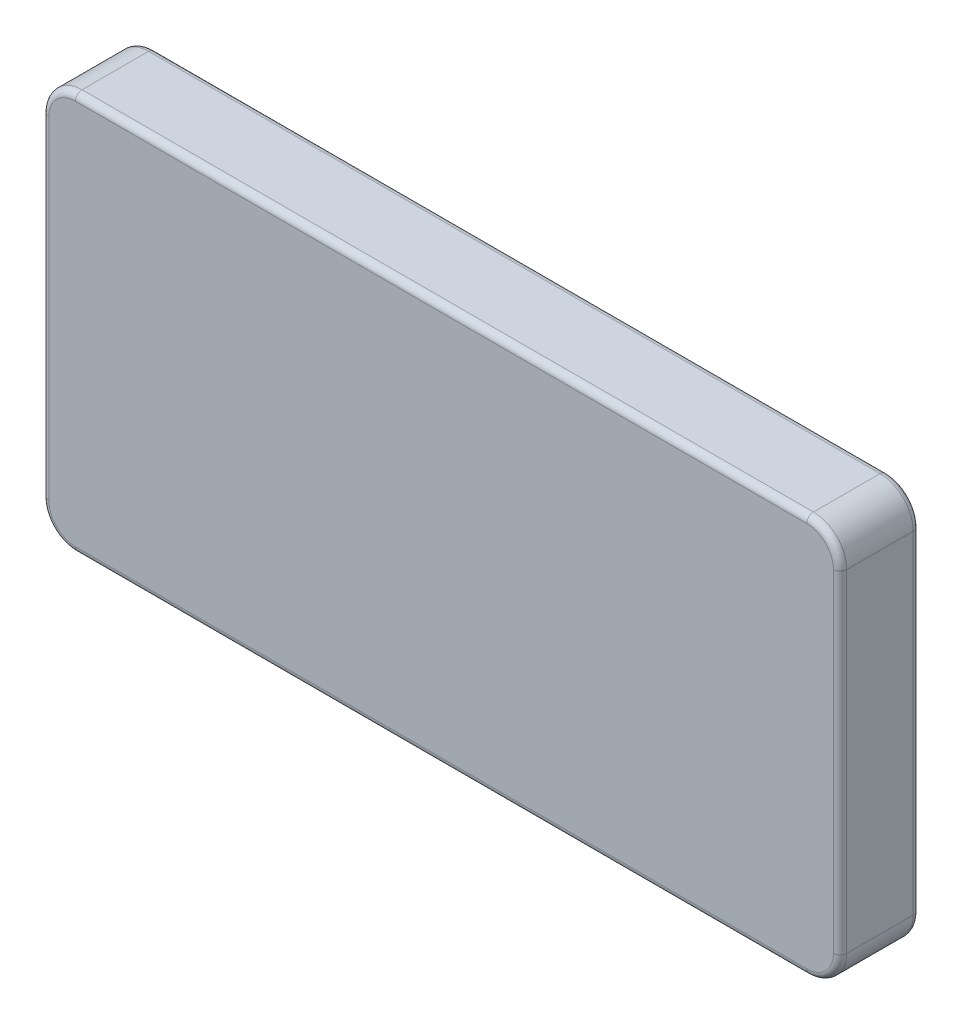
ISO-10303-21;
HEADER;
FILE_DESCRIPTION(('STEP AP214'),'2;1');
FILE_NAME('part.step','',(''),(''),'','','');
FILE_SCHEMA(('AUTOMOTIVE_DESIGN { 1 0 10303 214 1 1 1 1 }'));
ENDSEC;
DATA;
#1=APPLICATION_CONTEXT('core data for automotive mechanical design processes');
#2=APPLICATION_PROTOCOL_DEFINITION('international standard','automotive_design',2000,#1);
#3=PRODUCT_CONTEXT('',#1,'mechanical');
#4=PRODUCT('Part','Part','',(#3));
#5=PRODUCT_RELATED_PRODUCT_CATEGORY('part','',(#4));
#6=PRODUCT_DEFINITION_FORMATION('','',#4);
#7=PRODUCT_DEFINITION_CONTEXT('part definition',#1,'design');
#8=PRODUCT_DEFINITION('design','',#6,#7);
#9=PRODUCT_DEFINITION_SHAPE('','',#8);
#10=(LENGTH_UNIT() NAMED_UNIT(*) SI_UNIT(.MILLI.,.METRE.));
#11=(NAMED_UNIT(*) PLANE_ANGLE_UNIT() SI_UNIT($,.RADIAN.));
#12=(NAMED_UNIT(*) SI_UNIT($,.STERADIAN.) SOLID_ANGLE_UNIT());
#13=UNCERTAINTY_MEASURE_WITH_UNIT(LENGTH_MEASURE(1.E-05),#10,'distance_accuracy_value','');
#14=(GEOMETRIC_REPRESENTATION_CONTEXT(3) GLOBAL_UNCERTAINTY_ASSIGNED_CONTEXT((#13)) GLOBAL_UNIT_ASSIGNED_CONTEXT((#10,
#11,#12)) REPRESENTATION_CONTEXT('',''));
#15=CARTESIAN_POINT('',(0.,0.,0.));
#16=DIRECTION('',(0.,0.,1.));
#17=DIRECTION('',(1.,0.,0.));
#18=AXIS2_PLACEMENT_3D('',#15,#16,#17);
#19=CARTESIAN_POINT('',(0.,0.,120.));
#20=DIRECTION('',(0.,0.,-1.));
#21=DIRECTION('',(-1.,0.,0.));
#22=AXIS2_PLACEMENT_3D('',#19,#20,#21);
#23=PLANE('',#22);
#24=CARTESIAN_POINT('',(1150.,50.,120.));
#25=DIRECTION('',(0.,0.,-1.));
#26=DIRECTION('',(-1.,0.,0.));
#27=AXIS2_PLACEMENT_3D('',#24,#25,#26);
#28=CIRCLE('',#27,40.);
#29=CARTESIAN_POINT('',(1190.,50.,120.));
#30=VERTEX_POINT('',#29);
#31=CARTESIAN_POINT('',(1150.,10.,120.));
#32=VERTEX_POINT('',#31);
#33=EDGE_CURVE('E214',#30,#32,#28,.T.);
#34=ORIENTED_EDGE('',*,*,#33,.F.);
#35=DIRECTION('',(0.,1.,0.));
#36=VECTOR('',#35,1.);
#37=CARTESIAN_POINT('',(1190.,0.,120.));
#38=LINE('',#37,#36);
#39=CARTESIAN_POINT('',(1190.,550.,120.));
#40=VERTEX_POINT('',#39);
#41=EDGE_CURVE('E281',#30,#40,#38,.T.);
#42=ORIENTED_EDGE('',*,*,#41,.T.);
#43=CARTESIAN_POINT('',(1150.,550.,120.));
#44=DIRECTION('',(0.,0.,-1.));
#45=DIRECTION('',(-1.,0.,0.));
#46=AXIS2_PLACEMENT_3D('',#43,#44,#45);
#47=CIRCLE('',#46,40.);
#48=CARTESIAN_POINT('',(1150.,590.,120.));
#49=VERTEX_POINT('',#48);
#50=EDGE_CURVE('E211',#49,#40,#47,.T.);
#51=ORIENTED_EDGE('',*,*,#50,.F.);
#52=DIRECTION('',(-1.,0.,0.));
#53=VECTOR('',#52,1.);
#54=CARTESIAN_POINT('',(0.,590.,120.));
#55=LINE('',#54,#53);
#56=CARTESIAN_POINT('',(50.,590.,120.));
#57=VERTEX_POINT('',#56);
#58=EDGE_CURVE('E192',#49,#57,#55,.T.);
#59=ORIENTED_EDGE('',*,*,#58,.T.);
#60=CARTESIAN_POINT('',(50.,550.,120.));
#61=DIRECTION('',(0.,0.,-1.));
#62=DIRECTION('',(-1.,0.,0.));
#63=AXIS2_PLACEMENT_3D('',#60,#61,#62);
#64=CIRCLE('',#63,40.);
#65=CARTESIAN_POINT('',(10.,550.,120.));
#66=VERTEX_POINT('',#65);
#67=EDGE_CURVE('E205',#66,#57,#64,.T.);
#68=ORIENTED_EDGE('',*,*,#67,.F.);
#69=DIRECTION('',(0.,-1.,0.));
#70=VECTOR('',#69,1.);
#71=CARTESIAN_POINT('',(10.,0.,120.));
#72=LINE('',#71,#70);
#73=CARTESIAN_POINT('',(10.,50.,120.));
#74=VERTEX_POINT('',#73);
#75=EDGE_CURVE('E287',#66,#74,#72,.T.);
#76=ORIENTED_EDGE('',*,*,#75,.T.);
#77=CARTESIAN_POINT('',(50.,50.,120.));
#78=DIRECTION('',(0.,0.,-1.));
#79=DIRECTION('',(-1.,0.,0.));
#80=AXIS2_PLACEMENT_3D('',#77,#78,#79);
#81=CIRCLE('',#80,40.);
#82=CARTESIAN_POINT('',(50.,10.,120.));
#83=VERTEX_POINT('',#82);
#84=EDGE_CURVE('E208',#83,#74,#81,.T.);
#85=ORIENTED_EDGE('',*,*,#84,.F.);
#86=DIRECTION('',(1.,0.,0.));
#87=VECTOR('',#86,1.);
#88=CARTESIAN_POINT('',(0.,10.,120.));
#89=LINE('',#88,#87);
#90=EDGE_CURVE('E282',#83,#32,#89,.T.);
#91=ORIENTED_EDGE('',*,*,#90,.T.);
#92=EDGE_LOOP('',(#34,#42,#51,#59,#68,#76,#85,#91));
#93=FACE_BOUND('',#92,.T.);
#94=ADVANCED_FACE('F35',(#93),#23,.F.);
#95=CARTESIAN_POINT('',(0.,0.,0.));
#96=DIRECTION('',(0.,0.,-1.));
#97=DIRECTION('',(-1.,0.,0.));
#98=AXIS2_PLACEMENT_3D('',#95,#96,#97);
#99=PLANE('',#98);
#100=CARTESIAN_POINT('',(1150.,50.,0.));
#101=DIRECTION('',(0.,0.,-1.));
#102=DIRECTION('',(-1.,0.,0.));
#103=AXIS2_PLACEMENT_3D('',#100,#101,#102);
#104=CIRCLE('',#103,40.);
#105=CARTESIAN_POINT('',(1150.,10.,0.));
#106=VERTEX_POINT('',#105);
#107=CARTESIAN_POINT('',(1190.,50.,0.));
#108=VERTEX_POINT('',#107);
#109=EDGE_CURVE('E186',#106,#108,#104,.F.);
#110=ORIENTED_EDGE('',*,*,#109,.F.);
#111=DIRECTION('',(1.,0.,0.));
#112=VECTOR('',#111,1.);
#113=CARTESIAN_POINT('',(0.,10.,0.));
#114=LINE('',#113,#112);
#115=CARTESIAN_POINT('',(50.,10.,0.));
#116=VERTEX_POINT('',#115);
#117=EDGE_CURVE('E299',#106,#116,#114,.F.);
#118=ORIENTED_EDGE('',*,*,#117,.T.);
#119=CARTESIAN_POINT('',(50.,50.,0.));
#120=DIRECTION('',(0.,0.,-1.));
#121=DIRECTION('',(-1.,0.,0.));
#122=AXIS2_PLACEMENT_3D('',#119,#120,#121);
#123=CIRCLE('',#122,40.);
#124=CARTESIAN_POINT('',(10.,50.,0.));
#125=VERTEX_POINT('',#124);
#126=EDGE_CURVE('E190',#125,#116,#123,.F.);
#127=ORIENTED_EDGE('',*,*,#126,.F.);
#128=DIRECTION('',(0.,-1.,0.));
#129=VECTOR('',#128,1.);
#130=CARTESIAN_POINT('',(10.,600.,0.));
#131=LINE('',#130,#129);
#132=CARTESIAN_POINT('',(10.,550.,0.));
#133=VERTEX_POINT('',#132);
#134=EDGE_CURVE('E307',#125,#133,#131,.F.);
#135=ORIENTED_EDGE('',*,*,#134,.T.);
#136=CARTESIAN_POINT('',(50.,550.,0.));
#137=DIRECTION('',(0.,0.,-1.));
#138=DIRECTION('',(-1.,0.,0.));
#139=AXIS2_PLACEMENT_3D('',#136,#137,#138);
#140=CIRCLE('',#139,40.);
#141=CARTESIAN_POINT('',(50.,590.,0.));
#142=VERTEX_POINT('',#141);
#143=EDGE_CURVE('E187',#142,#133,#140,.F.);
#144=ORIENTED_EDGE('',*,*,#143,.F.);
#145=DIRECTION('',(-1.,0.,0.));
#146=VECTOR('',#145,1.);
#147=CARTESIAN_POINT('',(1200.,590.,0.));
#148=LINE('',#147,#146);
#149=CARTESIAN_POINT('',(1150.,590.,0.));
#150=VERTEX_POINT('',#149);
#151=EDGE_CURVE('E304',#142,#150,#148,.F.);
#152=ORIENTED_EDGE('',*,*,#151,.T.);
#153=CARTESIAN_POINT('',(1150.,550.,0.));
#154=DIRECTION('',(0.,0.,-1.));
#155=DIRECTION('',(-1.,0.,0.));
#156=AXIS2_PLACEMENT_3D('',#153,#154,#155);
#157=CIRCLE('',#156,40.);
#158=CARTESIAN_POINT('',(1190.,550.,0.));
#159=VERTEX_POINT('',#158);
#160=EDGE_CURVE('E198',#159,#150,#157,.F.);
#161=ORIENTED_EDGE('',*,*,#160,.F.);
#162=DIRECTION('',(0.,1.,0.));
#163=VECTOR('',#162,1.);
#164=CARTESIAN_POINT('',(1190.,0.,0.));
#165=LINE('',#164,#163);
#166=EDGE_CURVE('E302',#159,#108,#165,.F.);
#167=ORIENTED_EDGE('',*,*,#166,.T.);
#168=EDGE_LOOP('',(#110,#118,#127,#135,#144,#152,#161,#167));
#169=FACE_BOUND('',#168,.T.);
#170=ADVANCED_FACE('F338',(#169),#99,.T.);
#171=CARTESIAN_POINT('',(0.,0.,120.));
#172=DIRECTION('',(1.,0.,0.));
#173=DIRECTION('',(0.,0.,-1.));
#174=AXIS2_PLACEMENT_3D('',#171,#172,#173);
#175=PLANE('',#174);
#176=DIRECTION('',(0.,-1.,0.));
#177=VECTOR('',#176,1.);
#178=CARTESIAN_POINT('',(0.,0.,110.));
#179=LINE('',#178,#177);
#180=CARTESIAN_POINT('',(0.,50.,110.));
#181=VERTEX_POINT('',#180);
#182=CARTESIAN_POINT('',(0.,550.,110.));
#183=VERTEX_POINT('',#182);
#184=EDGE_CURVE('E292',#181,#183,#179,.F.);
#185=ORIENTED_EDGE('',*,*,#184,.T.);
#186=DIRECTION('',(0.,0.,-1.));
#187=VECTOR('',#186,1.);
#188=CARTESIAN_POINT('',(0.,550.,120.));
#189=LINE('',#188,#187);
#190=CARTESIAN_POINT('',(0.,550.,9.99999999999999));
#191=VERTEX_POINT('',#190);
#192=EDGE_CURVE('E243',#183,#191,#189,.T.);
#193=ORIENTED_EDGE('',*,*,#192,.T.);
#194=DIRECTION('',(0.,-1.,0.));
#195=VECTOR('',#194,1.);
#196=CARTESIAN_POINT('',(0.,0.,9.99999999999999));
#197=LINE('',#196,#195);
#198=CARTESIAN_POINT('',(0.,50.,9.99999999999999));
#199=VERTEX_POINT('',#198);
#200=EDGE_CURVE('E289',#191,#199,#197,.T.);
#201=ORIENTED_EDGE('',*,*,#200,.T.);
#202=DIRECTION('',(0.,0.,-1.));
#203=VECTOR('',#202,1.);
#204=CARTESIAN_POINT('',(0.,50.,120.));
#205=LINE('',#204,#203);
#206=EDGE_CURVE('E241',#199,#181,#205,.F.);
#207=ORIENTED_EDGE('',*,*,#206,.T.);
#208=EDGE_LOOP('',(#185,#193,#201,#207));
#209=FACE_BOUND('',#208,.T.);
#210=ADVANCED_FACE('F369',(#209),#175,.F.);
#211=CARTESIAN_POINT('',(0.,0.,120.));
#212=DIRECTION('',(0.,1.,0.));
#213=DIRECTION('',(0.,0.,1.));
#214=AXIS2_PLACEMENT_3D('',#211,#212,#213);
#215=PLANE('',#214);
#216=DIRECTION('',(1.,0.,0.));
#217=VECTOR('',#216,1.);
#218=CARTESIAN_POINT('',(0.,0.,110.));
#219=LINE('',#218,#217);
#220=CARTESIAN_POINT('',(1150.,0.,110.));
#221=VERTEX_POINT('',#220);
#222=CARTESIAN_POINT('',(50.,0.,110.));
#223=VERTEX_POINT('',#222);
#224=EDGE_CURVE('E251',#221,#223,#219,.F.);
#225=ORIENTED_EDGE('',*,*,#224,.T.);
#226=DIRECTION('',(0.,0.,-1.));
#227=VECTOR('',#226,1.);
#228=CARTESIAN_POINT('',(50.,0.,120.));
#229=LINE('',#228,#227);
#230=CARTESIAN_POINT('',(50.,0.,9.99999999999999));
#231=VERTEX_POINT('',#230);
#232=EDGE_CURVE('E162',#223,#231,#229,.T.);
#233=ORIENTED_EDGE('',*,*,#232,.T.);
#234=DIRECTION('',(1.,0.,0.));
#235=VECTOR('',#234,1.);
#236=CARTESIAN_POINT('',(1200.,0.,9.99999999999999));
#237=LINE('',#236,#235);
#238=CARTESIAN_POINT('',(1150.,0.,9.99999999999999));
#239=VERTEX_POINT('',#238);
#240=EDGE_CURVE('E310',#231,#239,#237,.T.);
#241=ORIENTED_EDGE('',*,*,#240,.T.);
#242=DIRECTION('',(0.,0.,-1.));
#243=VECTOR('',#242,1.);
#244=CARTESIAN_POINT('',(1150.,0.,120.));
#245=LINE('',#244,#243);
#246=EDGE_CURVE('E179',#239,#221,#245,.F.);
#247=ORIENTED_EDGE('',*,*,#246,.T.);
#248=EDGE_LOOP('',(#225,#233,#241,#247));
#249=FACE_BOUND('',#248,.T.);
#250=ADVANCED_FACE('F317',(#249),#215,.F.);
#251=CARTESIAN_POINT('',(1200.,0.,120.));
#252=DIRECTION('',(-1.,0.,0.));
#253=DIRECTION('',(0.,0.,1.));
#254=AXIS2_PLACEMENT_3D('',#251,#252,#253);
#255=PLANE('',#254);
#256=DIRECTION('',(0.,1.,0.));
#257=VECTOR('',#256,1.);
#258=CARTESIAN_POINT('',(1200.,600.,9.99999999999999));
#259=LINE('',#258,#257);
#260=CARTESIAN_POINT('',(1200.,50.,9.99999999999999));
#261=VERTEX_POINT('',#260);
#262=CARTESIAN_POINT('',(1200.,550.,9.99999999999999));
#263=VERTEX_POINT('',#262);
#264=EDGE_CURVE('E154',#261,#263,#259,.T.);
#265=ORIENTED_EDGE('',*,*,#264,.T.);
#266=DIRECTION('',(0.,0.,-1.));
#267=VECTOR('',#266,1.);
#268=CARTESIAN_POINT('',(1200.,550.,120.));
#269=LINE('',#268,#267);
#270=CARTESIAN_POINT('',(1200.,550.,110.));
#271=VERTEX_POINT('',#270);
#272=EDGE_CURVE('E11',#263,#271,#269,.F.);
#273=ORIENTED_EDGE('',*,*,#272,.T.);
#274=DIRECTION('',(0.,1.,0.));
#275=VECTOR('',#274,1.);
#276=CARTESIAN_POINT('',(1200.,0.,110.));
#277=LINE('',#276,#275);
#278=CARTESIAN_POINT('',(1200.,50.,110.));
#279=VERTEX_POINT('',#278);
#280=EDGE_CURVE('E157',#271,#279,#277,.F.);
#281=ORIENTED_EDGE('',*,*,#280,.T.);
#282=DIRECTION('',(0.,0.,-1.));
#283=VECTOR('',#282,1.);
#284=CARTESIAN_POINT('',(1200.,50.,120.));
#285=LINE('',#284,#283);
#286=EDGE_CURVE('E44',#279,#261,#285,.T.);
#287=ORIENTED_EDGE('',*,*,#286,.T.);
#288=EDGE_LOOP('',(#265,#273,#281,#287));
#289=FACE_BOUND('',#288,.T.);
#290=ADVANCED_FACE('F153',(#289),#255,.F.);
#291=CARTESIAN_POINT('',(0.,600.,120.));
#292=DIRECTION('',(0.,-1.,0.));
#293=DIRECTION('',(0.,0.,-1.));
#294=AXIS2_PLACEMENT_3D('',#291,#292,#293);
#295=PLANE('',#294);
#296=DIRECTION('',(-1.,0.,0.));
#297=VECTOR('',#296,1.);
#298=CARTESIAN_POINT('',(0.,600.,9.99999999999999));
#299=LINE('',#298,#297);
#300=CARTESIAN_POINT('',(1150.,600.,9.99999999999999));
#301=VERTEX_POINT('',#300);
#302=CARTESIAN_POINT('',(50.,600.,9.99999999999999));
#303=VERTEX_POINT('',#302);
#304=EDGE_CURVE('E295',#301,#303,#299,.T.);
#305=ORIENTED_EDGE('',*,*,#304,.T.);
#306=DIRECTION('',(0.,0.,-1.));
#307=VECTOR('',#306,1.);
#308=CARTESIAN_POINT('',(50.,600.,120.));
#309=LINE('',#308,#307);
#310=CARTESIAN_POINT('',(50.,600.,110.));
#311=VERTEX_POINT('',#310);
#312=EDGE_CURVE('E59',#303,#311,#309,.F.);
#313=ORIENTED_EDGE('',*,*,#312,.T.);
#314=DIRECTION('',(-1.,0.,0.));
#315=VECTOR('',#314,1.);
#316=CARTESIAN_POINT('',(0.,600.,110.));
#317=LINE('',#316,#315);
#318=CARTESIAN_POINT('',(1150.,600.,110.));
#319=VERTEX_POINT('',#318);
#320=EDGE_CURVE('E173',#311,#319,#317,.F.);
#321=ORIENTED_EDGE('',*,*,#320,.T.);
#322=DIRECTION('',(0.,0.,-1.));
#323=VECTOR('',#322,1.);
#324=CARTESIAN_POINT('',(1150.,600.,120.));
#325=LINE('',#324,#323);
#326=EDGE_CURVE('E245',#319,#301,#325,.T.);
#327=ORIENTED_EDGE('',*,*,#326,.T.);
#328=EDGE_LOOP('',(#305,#313,#321,#327));
#329=FACE_BOUND('',#328,.T.);
#330=ADVANCED_FACE('F372',(#329),#295,.F.);
#331=CARTESIAN_POINT('',(0.,590.,9.99999999999999));
#332=DIRECTION('',(1.,0.,0.));
#333=DIRECTION('',(0.,0.,-1.));
#334=AXIS2_PLACEMENT_3D('',#331,#332,#333);
#335=CYLINDRICAL_SURFACE('',#334,10.);
#336=ORIENTED_EDGE('',*,*,#304,.F.);
#337=CARTESIAN_POINT('',(1150.,590.,9.99999999999999));
#338=DIRECTION('',(-1.,0.,0.));
#339=DIRECTION('',(0.,0.,1.));
#340=AXIS2_PLACEMENT_3D('',#337,#338,#339);
#341=CIRCLE('',#340,10.);
#342=EDGE_CURVE('E219',#301,#150,#341,.T.);
#343=ORIENTED_EDGE('',*,*,#342,.T.);
#344=ORIENTED_EDGE('',*,*,#151,.F.);
#345=CARTESIAN_POINT('',(50.,590.,10.));
#346=DIRECTION('',(1.,0.,0.));
#347=DIRECTION('',(0.,0.,-1.));
#348=AXIS2_PLACEMENT_3D('',#345,#346,#347);
#349=CIRCLE('',#348,10.);
#350=EDGE_CURVE('E217',#142,#303,#349,.T.);
#351=ORIENTED_EDGE('',*,*,#350,.T.);
#352=EDGE_LOOP('',(#336,#343,#344,#351));
#353=FACE_BOUND('',#352,.T.);
#354=ADVANCED_FACE('F375',(#353),#335,.T.);
#355=CARTESIAN_POINT('',(10.,0.,9.99999999999999));
#356=DIRECTION('',(0.,1.,0.));
#357=DIRECTION('',(0.,0.,1.));
#358=AXIS2_PLACEMENT_3D('',#355,#356,#357);
#359=CYLINDRICAL_SURFACE('',#358,10.);
#360=ORIENTED_EDGE('',*,*,#200,.F.);
#361=CARTESIAN_POINT('',(10.,550.,9.99999999999999));
#362=DIRECTION('',(0.,-1.,0.));
#363=DIRECTION('',(0.,0.,-1.));
#364=AXIS2_PLACEMENT_3D('',#361,#362,#363);
#365=CIRCLE('',#364,10.);
#366=EDGE_CURVE('E236',#191,#133,#365,.T.);
#367=ORIENTED_EDGE('',*,*,#366,.T.);
#368=ORIENTED_EDGE('',*,*,#134,.F.);
#369=CARTESIAN_POINT('',(10.,50.,10.));
#370=DIRECTION('',(0.,1.,0.));
#371=DIRECTION('',(0.,0.,1.));
#372=AXIS2_PLACEMENT_3D('',#369,#370,#371);
#373=CIRCLE('',#372,10.);
#374=EDGE_CURVE('E234',#125,#199,#373,.T.);
#375=ORIENTED_EDGE('',*,*,#374,.T.);
#376=EDGE_LOOP('',(#360,#367,#368,#375));
#377=FACE_BOUND('',#376,.T.);
#378=ADVANCED_FACE('F388',(#377),#359,.T.);
#379=CARTESIAN_POINT('',(1190.,0.,9.99999999999999));
#380=DIRECTION('',(0.,-1.,0.));
#381=DIRECTION('',(0.,0.,-1.));
#382=AXIS2_PLACEMENT_3D('',#379,#380,#381);
#383=CYLINDRICAL_SURFACE('',#382,10.);
#384=ORIENTED_EDGE('',*,*,#264,.F.);
#385=CARTESIAN_POINT('',(1190.,50.,9.99999999999999));
#386=DIRECTION('',(0.,1.,0.));
#387=DIRECTION('',(0.,0.,1.));
#388=AXIS2_PLACEMENT_3D('',#385,#386,#387);
#389=CIRCLE('',#388,10.);
#390=EDGE_CURVE('E169',#261,#108,#389,.T.);
#391=ORIENTED_EDGE('',*,*,#390,.T.);
#392=ORIENTED_EDGE('',*,*,#166,.F.);
#393=CARTESIAN_POINT('',(1190.,550.,10.));
#394=DIRECTION('',(0.,-1.,0.));
#395=DIRECTION('',(0.,0.,-1.));
#396=AXIS2_PLACEMENT_3D('',#393,#394,#395);
#397=CIRCLE('',#396,10.);
#398=EDGE_CURVE('E172',#159,#263,#397,.T.);
#399=ORIENTED_EDGE('',*,*,#398,.T.);
#400=EDGE_LOOP('',(#384,#391,#392,#399));
#401=FACE_BOUND('',#400,.T.);
#402=ADVANCED_FACE('F166',(#401),#383,.T.);
#403=CARTESIAN_POINT('',(0.,10.,9.99999999999999));
#404=DIRECTION('',(-1.,0.,0.));
#405=DIRECTION('',(0.,0.,1.));
#406=AXIS2_PLACEMENT_3D('',#403,#404,#405);
#407=CYLINDRICAL_SURFACE('',#406,10.);
#408=ORIENTED_EDGE('',*,*,#240,.F.);
#409=CARTESIAN_POINT('',(50.,10.,9.99999999999999));
#410=DIRECTION('',(1.,0.,0.));
#411=DIRECTION('',(0.,0.,-1.));
#412=AXIS2_PLACEMENT_3D('',#409,#410,#411);
#413=CIRCLE('',#412,10.);
#414=EDGE_CURVE('E228',#231,#116,#413,.T.);
#415=ORIENTED_EDGE('',*,*,#414,.T.);
#416=ORIENTED_EDGE('',*,*,#117,.F.);
#417=CARTESIAN_POINT('',(1150.,10.,10.));
#418=DIRECTION('',(-1.,0.,0.));
#419=DIRECTION('',(0.,0.,1.));
#420=AXIS2_PLACEMENT_3D('',#417,#418,#419);
#421=CIRCLE('',#420,10.);
#422=EDGE_CURVE('E226',#106,#239,#421,.T.);
#423=ORIENTED_EDGE('',*,*,#422,.T.);
#424=EDGE_LOOP('',(#408,#415,#416,#423));
#425=FACE_BOUND('',#424,.T.);
#426=ADVANCED_FACE('F336',(#425),#407,.T.);
#427=CARTESIAN_POINT('',(0.,10.,110.));
#428=DIRECTION('',(1.,0.,0.));
#429=DIRECTION('',(0.,0.,-1.));
#430=AXIS2_PLACEMENT_3D('',#427,#428,#429);
#431=CYLINDRICAL_SURFACE('',#430,10.);
#432=ORIENTED_EDGE('',*,*,#224,.F.);
#433=CARTESIAN_POINT('',(1150.,10.,110.));
#434=DIRECTION('',(-1.,0.,0.));
#435=DIRECTION('',(0.,0.,1.));
#436=AXIS2_PLACEMENT_3D('',#433,#434,#435);
#437=CIRCLE('',#436,10.);
#438=EDGE_CURVE('E203',#221,#32,#437,.T.);
#439=ORIENTED_EDGE('',*,*,#438,.T.);
#440=ORIENTED_EDGE('',*,*,#90,.F.);
#441=CARTESIAN_POINT('',(50.,10.,110.));
#442=DIRECTION('',(1.,0.,0.));
#443=DIRECTION('',(0.,0.,-1.));
#444=AXIS2_PLACEMENT_3D('',#441,#442,#443);
#445=CIRCLE('',#444,10.);
#446=EDGE_CURVE('E201',#83,#223,#445,.T.);
#447=ORIENTED_EDGE('',*,*,#446,.T.);
#448=EDGE_LOOP('',(#432,#439,#440,#447));
#449=FACE_BOUND('',#448,.T.);
#450=ADVANCED_FACE('F385',(#449),#431,.T.);
#451=CARTESIAN_POINT('',(1190.,0.,110.));
#452=DIRECTION('',(0.,1.,0.));
#453=DIRECTION('',(0.,0.,1.));
#454=AXIS2_PLACEMENT_3D('',#451,#452,#453);
#455=CYLINDRICAL_SURFACE('',#454,10.);
#456=ORIENTED_EDGE('',*,*,#280,.F.);
#457=CARTESIAN_POINT('',(1190.,550.,110.));
#458=DIRECTION('',(0.,-1.,0.));
#459=DIRECTION('',(0.,0.,-1.));
#460=AXIS2_PLACEMENT_3D('',#457,#458,#459);
#461=CIRCLE('',#460,10.);
#462=EDGE_CURVE('E224',#271,#40,#461,.T.);
#463=ORIENTED_EDGE('',*,*,#462,.T.);
#464=ORIENTED_EDGE('',*,*,#41,.F.);
#465=CARTESIAN_POINT('',(1190.,50.,110.));
#466=DIRECTION('',(0.,1.,0.));
#467=DIRECTION('',(0.,0.,1.));
#468=AXIS2_PLACEMENT_3D('',#465,#466,#467);
#469=CIRCLE('',#468,10.);
#470=EDGE_CURVE('E222',#30,#279,#469,.T.);
#471=ORIENTED_EDGE('',*,*,#470,.T.);
#472=EDGE_LOOP('',(#456,#463,#464,#471));
#473=FACE_BOUND('',#472,.T.);
#474=ADVANCED_FACE('F350',(#473),#455,.T.);
#475=CARTESIAN_POINT('',(10.,0.,110.));
#476=DIRECTION('',(0.,-1.,0.));
#477=DIRECTION('',(0.,0.,-1.));
#478=AXIS2_PLACEMENT_3D('',#475,#476,#477);
#479=CYLINDRICAL_SURFACE('',#478,10.);
#480=ORIENTED_EDGE('',*,*,#184,.F.);
#481=CARTESIAN_POINT('',(10.,50.,110.));
#482=DIRECTION('',(0.,1.,0.));
#483=DIRECTION('',(0.,0.,1.));
#484=AXIS2_PLACEMENT_3D('',#481,#482,#483);
#485=CIRCLE('',#484,10.);
#486=EDGE_CURVE('E232',#181,#74,#485,.T.);
#487=ORIENTED_EDGE('',*,*,#486,.T.);
#488=ORIENTED_EDGE('',*,*,#75,.F.);
#489=CARTESIAN_POINT('',(10.,550.,110.));
#490=DIRECTION('',(0.,-1.,0.));
#491=DIRECTION('',(0.,0.,-1.));
#492=AXIS2_PLACEMENT_3D('',#489,#490,#491);
#493=CIRCLE('',#492,10.);
#494=EDGE_CURVE('E230',#66,#183,#493,.T.);
#495=ORIENTED_EDGE('',*,*,#494,.T.);
#496=EDGE_LOOP('',(#480,#487,#488,#495));
#497=FACE_BOUND('',#496,.T.);
#498=ADVANCED_FACE('F398',(#497),#479,.T.);
#499=CARTESIAN_POINT('',(0.,590.,110.));
#500=DIRECTION('',(-1.,0.,0.));
#501=DIRECTION('',(0.,0.,1.));
#502=AXIS2_PLACEMENT_3D('',#499,#500,#501);
#503=CYLINDRICAL_SURFACE('',#502,10.);
#504=ORIENTED_EDGE('',*,*,#320,.F.);
#505=CARTESIAN_POINT('',(50.,590.,110.));
#506=DIRECTION('',(1.,0.,0.));
#507=DIRECTION('',(0.,0.,-1.));
#508=AXIS2_PLACEMENT_3D('',#505,#506,#507);
#509=CIRCLE('',#508,10.);
#510=EDGE_CURVE('E239',#311,#57,#509,.T.);
#511=ORIENTED_EDGE('',*,*,#510,.T.);
#512=ORIENTED_EDGE('',*,*,#58,.F.);
#513=CARTESIAN_POINT('',(1150.,590.,110.));
#514=DIRECTION('',(-1.,0.,0.));
#515=DIRECTION('',(0.,0.,1.));
#516=AXIS2_PLACEMENT_3D('',#513,#514,#515);
#517=CIRCLE('',#516,10.);
#518=EDGE_CURVE('E52',#49,#319,#517,.T.);
#519=ORIENTED_EDGE('',*,*,#518,.T.);
#520=EDGE_LOOP('',(#504,#511,#512,#519));
#521=FACE_BOUND('',#520,.T.);
#522=ADVANCED_FACE('F276',(#521),#503,.T.);
#523=CARTESIAN_POINT('',(1150.,50.,110.));
#524=DIRECTION('',(0.,0.,-1.));
#525=DIRECTION('',(-1.,0.,0.));
#526=AXIS2_PLACEMENT_3D('',#523,#524,#525);
#527=TOROIDAL_SURFACE('',#526,40.,10.);
#528=ORIENTED_EDGE('',*,*,#33,.T.);
#529=ORIENTED_EDGE('',*,*,#438,.F.);
#530=CARTESIAN_POINT('',(1150.,50.,110.));
#531=DIRECTION('',(0.,0.,-1.));
#532=DIRECTION('',(-1.,0.,0.));
#533=AXIS2_PLACEMENT_3D('',#530,#531,#532);
#534=CIRCLE('',#533,50.);
#535=EDGE_CURVE('E182',#279,#221,#534,.T.);
#536=ORIENTED_EDGE('',*,*,#535,.F.);
#537=ORIENTED_EDGE('',*,*,#470,.F.);
#538=EDGE_LOOP('',(#528,#529,#536,#537));
#539=FACE_BOUND('',#538,.T.);
#540=ADVANCED_FACE('F397',(#539),#527,.T.);
#541=CARTESIAN_POINT('',(1150.,50.,120.));
#542=DIRECTION('',(0.,0.,-1.));
#543=DIRECTION('',(-1.,0.,0.));
#544=AXIS2_PLACEMENT_3D('',#541,#542,#543);
#545=CYLINDRICAL_SURFACE('',#544,50.);
#546=ORIENTED_EDGE('',*,*,#535,.T.);
#547=ORIENTED_EDGE('',*,*,#246,.F.);
#548=CARTESIAN_POINT('',(1150.,50.,9.99999999999999));
#549=DIRECTION('',(0.,0.,-1.));
#550=DIRECTION('',(-1.,0.,0.));
#551=AXIS2_PLACEMENT_3D('',#548,#549,#550);
#552=CIRCLE('',#551,50.);
#553=EDGE_CURVE('E177',#261,#239,#552,.T.);
#554=ORIENTED_EDGE('',*,*,#553,.F.);
#555=ORIENTED_EDGE('',*,*,#286,.F.);
#556=EDGE_LOOP('',(#546,#547,#554,#555));
#557=FACE_BOUND('',#556,.T.);
#558=ADVANCED_FACE('F178',(#557),#545,.T.);
#559=CARTESIAN_POINT('',(1150.,50.,9.99999999999999));
#560=DIRECTION('',(0.,0.,-1.));
#561=DIRECTION('',(-1.,0.,0.));
#562=AXIS2_PLACEMENT_3D('',#559,#560,#561);
#563=TOROIDAL_SURFACE('',#562,40.,10.);
#564=ORIENTED_EDGE('',*,*,#390,.F.);
#565=ORIENTED_EDGE('',*,*,#553,.T.);
#566=ORIENTED_EDGE('',*,*,#422,.F.);
#567=ORIENTED_EDGE('',*,*,#109,.T.);
#568=EDGE_LOOP('',(#564,#565,#566,#567));
#569=FACE_BOUND('',#568,.T.);
#570=ADVANCED_FACE('F185',(#569),#563,.T.);
#571=CARTESIAN_POINT('',(1150.,550.,110.));
#572=DIRECTION('',(0.,0.,-1.));
#573=DIRECTION('',(-1.,0.,0.));
#574=AXIS2_PLACEMENT_3D('',#571,#572,#573);
#575=TOROIDAL_SURFACE('',#574,40.,10.);
#576=ORIENTED_EDGE('',*,*,#50,.T.);
#577=ORIENTED_EDGE('',*,*,#462,.F.);
#578=CARTESIAN_POINT('',(1150.,550.,110.));
#579=DIRECTION('',(0.,0.,-1.));
#580=DIRECTION('',(-1.,0.,0.));
#581=AXIS2_PLACEMENT_3D('',#578,#579,#580);
#582=CIRCLE('',#581,50.);
#583=EDGE_CURVE('E183',#319,#271,#582,.T.);
#584=ORIENTED_EDGE('',*,*,#583,.F.);
#585=ORIENTED_EDGE('',*,*,#518,.F.);
#586=EDGE_LOOP('',(#576,#577,#584,#585));
#587=FACE_BOUND('',#586,.T.);
#588=ADVANCED_FACE('F354',(#587),#575,.T.);
#589=CARTESIAN_POINT('',(1150.,550.,120.));
#590=DIRECTION('',(0.,0.,-1.));
#591=DIRECTION('',(-1.,0.,0.));
#592=AXIS2_PLACEMENT_3D('',#589,#590,#591);
#593=CYLINDRICAL_SURFACE('',#592,50.);
#594=ORIENTED_EDGE('',*,*,#583,.T.);
#595=ORIENTED_EDGE('',*,*,#272,.F.);
#596=CARTESIAN_POINT('',(1150.,550.,9.99999999999999));
#597=DIRECTION('',(0.,0.,-1.));
#598=DIRECTION('',(-1.,0.,0.));
#599=AXIS2_PLACEMENT_3D('',#596,#597,#598);
#600=CIRCLE('',#599,50.);
#601=EDGE_CURVE('E252',#301,#263,#600,.T.);
#602=ORIENTED_EDGE('',*,*,#601,.F.);
#603=ORIENTED_EDGE('',*,*,#326,.F.);
#604=EDGE_LOOP('',(#594,#595,#602,#603));
#605=FACE_BOUND('',#604,.T.);
#606=ADVANCED_FACE('F346',(#605),#593,.T.);
#607=CARTESIAN_POINT('',(1150.,550.,9.99999999999999));
#608=DIRECTION('',(0.,0.,-1.));
#609=DIRECTION('',(-1.,0.,0.));
#610=AXIS2_PLACEMENT_3D('',#607,#608,#609);
#611=TOROIDAL_SURFACE('',#610,40.,10.);
#612=ORIENTED_EDGE('',*,*,#342,.F.);
#613=ORIENTED_EDGE('',*,*,#601,.T.);
#614=ORIENTED_EDGE('',*,*,#398,.F.);
#615=ORIENTED_EDGE('',*,*,#160,.T.);
#616=EDGE_LOOP('',(#612,#613,#614,#615));
#617=FACE_BOUND('',#616,.T.);
#618=ADVANCED_FACE('F342',(#617),#611,.T.);
#619=CARTESIAN_POINT('',(50.,50.,110.));
#620=DIRECTION('',(0.,0.,-1.));
#621=DIRECTION('',(-1.,0.,0.));
#622=AXIS2_PLACEMENT_3D('',#619,#620,#621);
#623=TOROIDAL_SURFACE('',#622,40.,10.);
#624=ORIENTED_EDGE('',*,*,#84,.T.);
#625=ORIENTED_EDGE('',*,*,#486,.F.);
#626=CARTESIAN_POINT('',(50.,50.,110.));
#627=DIRECTION('',(0.,0.,-1.));
#628=DIRECTION('',(-1.,0.,0.));
#629=AXIS2_PLACEMENT_3D('',#626,#627,#628);
#630=CIRCLE('',#629,50.);
#631=EDGE_CURVE('E255',#223,#181,#630,.T.);
#632=ORIENTED_EDGE('',*,*,#631,.F.);
#633=ORIENTED_EDGE('',*,*,#446,.F.);
#634=EDGE_LOOP('',(#624,#625,#632,#633));
#635=FACE_BOUND('',#634,.T.);
#636=ADVANCED_FACE('F325',(#635),#623,.T.);
#637=CARTESIAN_POINT('',(50.,50.,120.));
#638=DIRECTION('',(0.,0.,-1.));
#639=DIRECTION('',(-1.,0.,0.));
#640=AXIS2_PLACEMENT_3D('',#637,#638,#639);
#641=CYLINDRICAL_SURFACE('',#640,50.);
#642=ORIENTED_EDGE('',*,*,#631,.T.);
#643=ORIENTED_EDGE('',*,*,#206,.F.);
#644=CARTESIAN_POINT('',(50.,50.,9.99999999999999));
#645=DIRECTION('',(0.,0.,-1.));
#646=DIRECTION('',(-1.,0.,0.));
#647=AXIS2_PLACEMENT_3D('',#644,#645,#646);
#648=CIRCLE('',#647,50.);
#649=EDGE_CURVE('E258',#231,#199,#648,.T.);
#650=ORIENTED_EDGE('',*,*,#649,.F.);
#651=ORIENTED_EDGE('',*,*,#232,.F.);
#652=EDGE_LOOP('',(#642,#643,#650,#651));
#653=FACE_BOUND('',#652,.T.);
#654=ADVANCED_FACE('F329',(#653),#641,.T.);
#655=CARTESIAN_POINT('',(50.,50.,9.99999999999999));
#656=DIRECTION('',(0.,0.,-1.));
#657=DIRECTION('',(-1.,0.,0.));
#658=AXIS2_PLACEMENT_3D('',#655,#656,#657);
#659=TOROIDAL_SURFACE('',#658,40.,10.);
#660=ORIENTED_EDGE('',*,*,#374,.F.);
#661=ORIENTED_EDGE('',*,*,#126,.T.);
#662=ORIENTED_EDGE('',*,*,#414,.F.);
#663=ORIENTED_EDGE('',*,*,#649,.T.);
#664=EDGE_LOOP('',(#660,#661,#662,#663));
#665=FACE_BOUND('',#664,.T.);
#666=ADVANCED_FACE('F332',(#665),#659,.T.);
#667=CARTESIAN_POINT('',(50.,550.,110.));
#668=DIRECTION('',(0.,0.,-1.));
#669=DIRECTION('',(-1.,0.,0.));
#670=AXIS2_PLACEMENT_3D('',#667,#668,#669);
#671=TOROIDAL_SURFACE('',#670,40.,10.);
#672=ORIENTED_EDGE('',*,*,#67,.T.);
#673=ORIENTED_EDGE('',*,*,#510,.F.);
#674=CARTESIAN_POINT('',(50.,550.,110.));
#675=DIRECTION('',(0.,0.,-1.));
#676=DIRECTION('',(-1.,0.,0.));
#677=AXIS2_PLACEMENT_3D('',#674,#675,#676);
#678=CIRCLE('',#677,50.);
#679=EDGE_CURVE('E39',#183,#311,#678,.T.);
#680=ORIENTED_EDGE('',*,*,#679,.F.);
#681=ORIENTED_EDGE('',*,*,#494,.F.);
#682=EDGE_LOOP('',(#672,#673,#680,#681));
#683=FACE_BOUND('',#682,.T.);
#684=ADVANCED_FACE('F37',(#683),#671,.T.);
#685=CARTESIAN_POINT('',(50.,550.,120.));
#686=DIRECTION('',(0.,0.,-1.));
#687=DIRECTION('',(-1.,0.,0.));
#688=AXIS2_PLACEMENT_3D('',#685,#686,#687);
#689=CYLINDRICAL_SURFACE('',#688,50.);
#690=ORIENTED_EDGE('',*,*,#679,.T.);
#691=ORIENTED_EDGE('',*,*,#312,.F.);
#692=CARTESIAN_POINT('',(50.,550.,9.99999999999999));
#693=DIRECTION('',(0.,0.,-1.));
#694=DIRECTION('',(-1.,0.,0.));
#695=AXIS2_PLACEMENT_3D('',#692,#693,#694);
#696=CIRCLE('',#695,50.);
#697=EDGE_CURVE('E262',#191,#303,#696,.T.);
#698=ORIENTED_EDGE('',*,*,#697,.F.);
#699=ORIENTED_EDGE('',*,*,#192,.F.);
#700=EDGE_LOOP('',(#690,#691,#698,#699));
#701=FACE_BOUND('',#700,.T.);
#702=ADVANCED_FACE('F271',(#701),#689,.T.);
#703=CARTESIAN_POINT('',(50.,550.,9.99999999999999));
#704=DIRECTION('',(0.,0.,-1.));
#705=DIRECTION('',(-1.,0.,0.));
#706=AXIS2_PLACEMENT_3D('',#703,#704,#705);
#707=TOROIDAL_SURFACE('',#706,40.,10.);
#708=ORIENTED_EDGE('',*,*,#350,.F.);
#709=ORIENTED_EDGE('',*,*,#143,.T.);
#710=ORIENTED_EDGE('',*,*,#366,.F.);
#711=ORIENTED_EDGE('',*,*,#697,.T.);
#712=EDGE_LOOP('',(#708,#709,#710,#711));
#713=FACE_BOUND('',#712,.T.);
#714=ADVANCED_FACE('F421',(#713),#707,.T.);
#715=CLOSED_SHELL('',(#94,#170,#210,#250,#290,#330,#354,#378,#402,#426,#450,#474,#498,#522,#540,
#558,#570,#588,#606,#618,#636,#654,#666,#684,#702,#714));
#716=MANIFOLD_SOLID_BREP('B2',#715);
#717=ADVANCED_BREP_SHAPE_REPRESENTATION('',(#18,#716),#14);
#718=SHAPE_DEFINITION_REPRESENTATION(#9,#717);
ENDSEC;
END-ISO-10303-21;
